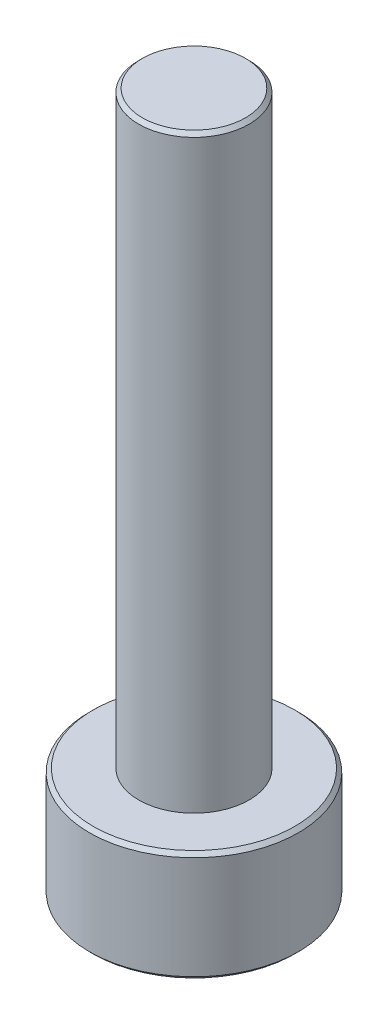
ISO-10303-21;
HEADER;
FILE_DESCRIPTION(('STEP AP214'),'2;1');
FILE_NAME('part.step','',(''),(''),'','','');
FILE_SCHEMA(('AUTOMOTIVE_DESIGN { 1 0 10303 214 1 1 1 1 }'));
ENDSEC;
DATA;
#1=APPLICATION_CONTEXT('core data for automotive mechanical design processes');
#2=APPLICATION_PROTOCOL_DEFINITION('international standard','automotive_design',2000,#1);
#3=PRODUCT_CONTEXT('',#1,'mechanical');
#4=PRODUCT('Part','Part','',(#3));
#5=PRODUCT_RELATED_PRODUCT_CATEGORY('part','',(#4));
#6=PRODUCT_DEFINITION_FORMATION('','',#4);
#7=PRODUCT_DEFINITION_CONTEXT('part definition',#1,'design');
#8=PRODUCT_DEFINITION('design','',#6,#7);
#9=PRODUCT_DEFINITION_SHAPE('','',#8);
#10=(LENGTH_UNIT() NAMED_UNIT(*) SI_UNIT(.MILLI.,.METRE.));
#11=(NAMED_UNIT(*) PLANE_ANGLE_UNIT() SI_UNIT($,.RADIAN.));
#12=(NAMED_UNIT(*) SI_UNIT($,.STERADIAN.) SOLID_ANGLE_UNIT());
#13=UNCERTAINTY_MEASURE_WITH_UNIT(LENGTH_MEASURE(1.E-05),#10,'distance_accuracy_value','');
#14=(GEOMETRIC_REPRESENTATION_CONTEXT(3) GLOBAL_UNCERTAINTY_ASSIGNED_CONTEXT((#13)) GLOBAL_UNIT_ASSIGNED_CONTEXT((#10,
#11,#12)) REPRESENTATION_CONTEXT('',''));
#15=CARTESIAN_POINT('',(0.,0.,0.));
#16=DIRECTION('',(0.,0.,1.));
#17=DIRECTION('',(1.,0.,0.));
#18=AXIS2_PLACEMENT_3D('',#15,#16,#17);
#19=CARTESIAN_POINT('',(0.,3.,0.));
#20=DIRECTION('',(0.,-1.,0.));
#21=DIRECTION('',(0.,0.,-1.));
#22=AXIS2_PLACEMENT_3D('',#19,#20,#21);
#23=CYLINDRICAL_SURFACE('',#22,2.84);
#24=CARTESIAN_POINT('',(0.,2.9,0.));
#25=DIRECTION('',(0.,1.,0.));
#26=DIRECTION('',(0.,0.,1.));
#27=AXIS2_PLACEMENT_3D('',#24,#25,#26);
#28=CIRCLE('',#27,2.84);
#29=CARTESIAN_POINT('',(0.,2.9,2.84));
#30=VERTEX_POINT('',#29);
#31=EDGE_CURVE('E44',#30,#30,#28,.F.);
#32=ORIENTED_EDGE('',*,*,#31,.T.);
#33=EDGE_LOOP('',(#32));
#34=FACE_BOUND('',#33,.T.);
#35=CARTESIAN_POINT('',(0.,0.100000000000001,0.));
#36=DIRECTION('',(0.,1.,0.));
#37=DIRECTION('',(0.,0.,1.));
#38=AXIS2_PLACEMENT_3D('',#35,#36,#37);
#39=CIRCLE('',#38,2.84);
#40=CARTESIAN_POINT('',(0.,0.100000000000001,2.84));
#41=VERTEX_POINT('',#40);
#42=EDGE_CURVE('E155',#41,#41,#39,.T.);
#43=ORIENTED_EDGE('',*,*,#42,.T.);
#44=EDGE_LOOP('',(#43));
#45=FACE_BOUND('',#44,.T.);
#46=ADVANCED_FACE('F36',(#34,#45),#23,.T.);
#47=CARTESIAN_POINT('',(0.,3.,0.));
#48=DIRECTION('',(0.,1.,0.));
#49=DIRECTION('',(0.,0.,1.));
#50=AXIS2_PLACEMENT_3D('',#47,#48,#49);
#51=PLANE('',#50);
#52=CARTESIAN_POINT('',(0.,3.,0.));
#53=DIRECTION('',(0.,1.,0.));
#54=DIRECTION('',(0.,0.,1.));
#55=AXIS2_PLACEMENT_3D('',#52,#53,#54);
#56=CIRCLE('',#55,2.74);
#57=CARTESIAN_POINT('',(0.,3.,2.74));
#58=VERTEX_POINT('',#57);
#59=EDGE_CURVE('E152',#58,#58,#56,.T.);
#60=ORIENTED_EDGE('',*,*,#59,.T.);
#61=EDGE_LOOP('',(#60));
#62=FACE_BOUND('',#61,.T.);
#63=CARTESIAN_POINT('',(0.,3.,0.));
#64=DIRECTION('',(0.,1.,0.));
#65=DIRECTION('',(0.,0.,1.));
#66=AXIS2_PLACEMENT_3D('',#63,#64,#65);
#67=CIRCLE('',#66,1.5);
#68=CARTESIAN_POINT('',(0.,3.,1.5));
#69=VERTEX_POINT('',#68);
#70=EDGE_CURVE('E138',#69,#69,#67,.T.);
#71=ORIENTED_EDGE('',*,*,#70,.F.);
#72=EDGE_LOOP('',(#71));
#73=FACE_BOUND('',#72,.T.);
#74=ADVANCED_FACE('F168',(#62,#73),#51,.T.);
#75=CARTESIAN_POINT('',(0.,0.,0.));
#76=DIRECTION('',(0.,1.,0.));
#77=DIRECTION('',(0.,0.,1.));
#78=AXIS2_PLACEMENT_3D('',#75,#76,#77);
#79=PLANE('',#78);
#80=CARTESIAN_POINT('',(0.,0.,0.));
#81=DIRECTION('',(0.,1.,0.));
#82=DIRECTION('',(0.,0.,1.));
#83=AXIS2_PLACEMENT_3D('',#80,#81,#82);
#84=CIRCLE('',#83,2.74);
#85=CARTESIAN_POINT('',(0.,0.,2.74));
#86=VERTEX_POINT('',#85);
#87=EDGE_CURVE('E11',#86,#86,#84,.F.);
#88=ORIENTED_EDGE('',*,*,#87,.T.);
#89=EDGE_LOOP('',(#88));
#90=FACE_BOUND('',#89,.T.);
#91=DIRECTION('',(0.,0.,1.));
#92=VECTOR('',#91,1.);
#93=CARTESIAN_POINT('',(1.29,0.,-0.744781847254618));
#94=LINE('',#93,#92);
#95=CARTESIAN_POINT('',(1.29,0.,-0.744781847254618));
#96=VERTEX_POINT('',#95);
#97=CARTESIAN_POINT('',(1.29,0.,0.744781847254619));
#98=VERTEX_POINT('',#97);
#99=EDGE_CURVE('E125',#96,#98,#94,.T.);
#100=ORIENTED_EDGE('',*,*,#99,.F.);
#101=DIRECTION('',(0.866025403784439,0.,0.5));
#102=VECTOR('',#101,1.);
#103=CARTESIAN_POINT('',(0.,0.,-1.48956369450924));
#104=LINE('',#103,#102);
#105=CARTESIAN_POINT('',(0.,0.,-1.48956369450924));
#106=VERTEX_POINT('',#105);
#107=EDGE_CURVE('E51',#106,#96,#104,.T.);
#108=ORIENTED_EDGE('',*,*,#107,.F.);
#109=DIRECTION('',(0.866025403784439,0.,-0.5));
#110=VECTOR('',#109,1.);
#111=CARTESIAN_POINT('',(-1.29,0.,-0.744781847254618));
#112=LINE('',#111,#110);
#113=CARTESIAN_POINT('',(-1.29,0.,-0.744781847254618));
#114=VERTEX_POINT('',#113);
#115=EDGE_CURVE('E134',#114,#106,#112,.T.);
#116=ORIENTED_EDGE('',*,*,#115,.F.);
#117=DIRECTION('',(0.,0.,-1.));
#118=VECTOR('',#117,1.);
#119=CARTESIAN_POINT('',(-1.29,0.,0.744781847254619));
#120=LINE('',#119,#118);
#121=CARTESIAN_POINT('',(-1.29,0.,0.744781847254619));
#122=VERTEX_POINT('',#121);
#123=EDGE_CURVE('E132',#122,#114,#120,.T.);
#124=ORIENTED_EDGE('',*,*,#123,.F.);
#125=DIRECTION('',(-0.866025403784439,0.,-0.5));
#126=VECTOR('',#125,1.);
#127=CARTESIAN_POINT('',(0.,0.,1.48956369450924));
#128=LINE('',#127,#126);
#129=CARTESIAN_POINT('',(0.,0.,1.48956369450924));
#130=VERTEX_POINT('',#129);
#131=EDGE_CURVE('E99',#130,#122,#128,.T.);
#132=ORIENTED_EDGE('',*,*,#131,.F.);
#133=DIRECTION('',(-0.866025403784439,0.,0.5));
#134=VECTOR('',#133,1.);
#135=CARTESIAN_POINT('',(1.29,0.,0.744781847254619));
#136=LINE('',#135,#134);
#137=EDGE_CURVE('E128',#98,#130,#136,.T.);
#138=ORIENTED_EDGE('',*,*,#137,.F.);
#139=EDGE_LOOP('',(#100,#108,#116,#124,#132,#138));
#140=FACE_BOUND('',#139,.T.);
#141=ADVANCED_FACE('F171',(#90,#140),#79,.F.);
#142=CARTESIAN_POINT('',(0.,19.,0.));
#143=DIRECTION('',(0.,-1.,0.));
#144=DIRECTION('',(0.,0.,-1.));
#145=AXIS2_PLACEMENT_3D('',#142,#143,#144);
#146=CYLINDRICAL_SURFACE('',#145,1.5);
#147=CARTESIAN_POINT('',(0.,18.9,0.));
#148=DIRECTION('',(0.,1.,0.));
#149=DIRECTION('',(0.,0.,1.));
#150=AXIS2_PLACEMENT_3D('',#147,#148,#149);
#151=CIRCLE('',#150,1.5);
#152=CARTESIAN_POINT('',(0.,18.9,1.5));
#153=VERTEX_POINT('',#152);
#154=EDGE_CURVE('E149',#153,#153,#151,.F.);
#155=ORIENTED_EDGE('',*,*,#154,.T.);
#156=EDGE_LOOP('',(#155));
#157=FACE_BOUND('',#156,.T.);
#158=ORIENTED_EDGE('',*,*,#70,.T.);
#159=EDGE_LOOP('',(#158));
#160=FACE_BOUND('',#159,.T.);
#161=ADVANCED_FACE('F175',(#157,#160),#146,.T.);
#162=CARTESIAN_POINT('',(0.,19.,0.));
#163=DIRECTION('',(0.,1.,0.));
#164=DIRECTION('',(0.,0.,1.));
#165=AXIS2_PLACEMENT_3D('',#162,#163,#164);
#166=PLANE('',#165);
#167=CARTESIAN_POINT('',(0.,19.,0.));
#168=DIRECTION('',(0.,1.,0.));
#169=DIRECTION('',(0.,0.,1.));
#170=AXIS2_PLACEMENT_3D('',#167,#168,#169);
#171=CIRCLE('',#170,1.4);
#172=CARTESIAN_POINT('',(0.,19.,1.4));
#173=VERTEX_POINT('',#172);
#174=EDGE_CURVE('E146',#173,#173,#171,.T.);
#175=ORIENTED_EDGE('',*,*,#174,.T.);
#176=EDGE_LOOP('',(#175));
#177=FACE_BOUND('',#176,.T.);
#178=ADVANCED_FACE('F177',(#177),#166,.T.);
#179=CARTESIAN_POINT('',(0.,1.3,-1.48956369450924));
#180=DIRECTION('',(0.5,0.,-0.866025403784439));
#181=DIRECTION('',(-0.866025403784439,0.,-0.5));
#182=AXIS2_PLACEMENT_3D('',#179,#180,#181);
#183=PLANE('',#182);
#184=ORIENTED_EDGE('',*,*,#107,.T.);
#185=DIRECTION('',(0.,-1.,0.));
#186=VECTOR('',#185,1.);
#187=CARTESIAN_POINT('',(1.29,1.3,-0.744781847254618));
#188=LINE('',#187,#186);
#189=CARTESIAN_POINT('',(1.29,1.3,-0.744781847254618));
#190=VERTEX_POINT('',#189);
#191=EDGE_CURVE('E81',#190,#96,#188,.T.);
#192=ORIENTED_EDGE('',*,*,#191,.F.);
#193=DIRECTION('',(0.866025403784439,0.,0.5));
#194=VECTOR('',#193,1.);
#195=CARTESIAN_POINT('',(0.,1.3,-1.48956369450924));
#196=LINE('',#195,#194);
#197=CARTESIAN_POINT('',(0.,1.3,-1.48956369450924));
#198=VERTEX_POINT('',#197);
#199=EDGE_CURVE('E136',#198,#190,#196,.T.);
#200=ORIENTED_EDGE('',*,*,#199,.F.);
#201=DIRECTION('',(0.,-1.,0.));
#202=VECTOR('',#201,1.);
#203=CARTESIAN_POINT('',(0.,1.3,-1.48956369450924));
#204=LINE('',#203,#202);
#205=EDGE_CURVE('E59',#198,#106,#204,.T.);
#206=ORIENTED_EDGE('',*,*,#205,.T.);
#207=EDGE_LOOP('',(#184,#192,#200,#206));
#208=FACE_BOUND('',#207,.T.);
#209=ADVANCED_FACE('F184',(#208),#183,.F.);
#210=CARTESIAN_POINT('',(-1.29,1.3,-0.744781847254618));
#211=DIRECTION('',(-0.5,0.,-0.866025403784439));
#212=DIRECTION('',(-0.866025403784439,0.,0.5));
#213=AXIS2_PLACEMENT_3D('',#210,#211,#212);
#214=PLANE('',#213);
#215=ORIENTED_EDGE('',*,*,#115,.T.);
#216=ORIENTED_EDGE('',*,*,#205,.F.);
#217=DIRECTION('',(0.866025403784439,0.,-0.5));
#218=VECTOR('',#217,1.);
#219=CARTESIAN_POINT('',(-1.29,1.3,-0.744781847254618));
#220=LINE('',#219,#218);
#221=CARTESIAN_POINT('',(-1.29,1.3,-0.744781847254618));
#222=VERTEX_POINT('',#221);
#223=EDGE_CURVE('E111',#222,#198,#220,.T.);
#224=ORIENTED_EDGE('',*,*,#223,.F.);
#225=DIRECTION('',(0.,-1.,0.));
#226=VECTOR('',#225,1.);
#227=CARTESIAN_POINT('',(-1.29,1.3,-0.744781847254618));
#228=LINE('',#227,#226);
#229=EDGE_CURVE('E103',#222,#114,#228,.T.);
#230=ORIENTED_EDGE('',*,*,#229,.T.);
#231=EDGE_LOOP('',(#215,#216,#224,#230));
#232=FACE_BOUND('',#231,.T.);
#233=ADVANCED_FACE('F211',(#232),#214,.F.);
#234=CARTESIAN_POINT('',(-1.29,1.3,0.744781847254619));
#235=DIRECTION('',(-1.,0.,0.));
#236=DIRECTION('',(0.,0.,1.));
#237=AXIS2_PLACEMENT_3D('',#234,#235,#236);
#238=PLANE('',#237);
#239=ORIENTED_EDGE('',*,*,#123,.T.);
#240=ORIENTED_EDGE('',*,*,#229,.F.);
#241=DIRECTION('',(0.,0.,-1.));
#242=VECTOR('',#241,1.);
#243=CARTESIAN_POINT('',(-1.29,1.3,0.744781847254619));
#244=LINE('',#243,#242);
#245=CARTESIAN_POINT('',(-1.29,1.3,0.744781847254619));
#246=VERTEX_POINT('',#245);
#247=EDGE_CURVE('E107',#246,#222,#244,.T.);
#248=ORIENTED_EDGE('',*,*,#247,.F.);
#249=DIRECTION('',(0.,-1.,0.));
#250=VECTOR('',#249,1.);
#251=CARTESIAN_POINT('',(-1.29,1.3,0.744781847254619));
#252=LINE('',#251,#250);
#253=EDGE_CURVE('E92',#246,#122,#252,.T.);
#254=ORIENTED_EDGE('',*,*,#253,.T.);
#255=EDGE_LOOP('',(#239,#240,#248,#254));
#256=FACE_BOUND('',#255,.T.);
#257=ADVANCED_FACE('F108',(#256),#238,.F.);
#258=CARTESIAN_POINT('',(0.,1.3,1.48956369450924));
#259=DIRECTION('',(-0.5,0.,0.866025403784439));
#260=DIRECTION('',(0.866025403784439,0.,0.5));
#261=AXIS2_PLACEMENT_3D('',#258,#259,#260);
#262=PLANE('',#261);
#263=ORIENTED_EDGE('',*,*,#131,.T.);
#264=ORIENTED_EDGE('',*,*,#253,.F.);
#265=DIRECTION('',(-0.866025403784439,0.,-0.5));
#266=VECTOR('',#265,1.);
#267=CARTESIAN_POINT('',(0.,1.3,1.48956369450924));
#268=LINE('',#267,#266);
#269=CARTESIAN_POINT('',(0.,1.3,1.48956369450924));
#270=VERTEX_POINT('',#269);
#271=EDGE_CURVE('E96',#270,#246,#268,.T.);
#272=ORIENTED_EDGE('',*,*,#271,.F.);
#273=DIRECTION('',(0.,-1.,0.));
#274=VECTOR('',#273,1.);
#275=CARTESIAN_POINT('',(0.,1.3,1.48956369450924));
#276=LINE('',#275,#274);
#277=EDGE_CURVE('E104',#270,#130,#276,.T.);
#278=ORIENTED_EDGE('',*,*,#277,.T.);
#279=EDGE_LOOP('',(#263,#264,#272,#278));
#280=FACE_BOUND('',#279,.T.);
#281=ADVANCED_FACE('F94',(#280),#262,.F.);
#282=CARTESIAN_POINT('',(1.29,1.3,0.744781847254619));
#283=DIRECTION('',(0.5,0.,0.866025403784439));
#284=DIRECTION('',(0.866025403784439,0.,-0.5));
#285=AXIS2_PLACEMENT_3D('',#282,#283,#284);
#286=PLANE('',#285);
#287=ORIENTED_EDGE('',*,*,#137,.T.);
#288=ORIENTED_EDGE('',*,*,#277,.F.);
#289=DIRECTION('',(-0.866025403784439,0.,0.5));
#290=VECTOR('',#289,1.);
#291=CARTESIAN_POINT('',(1.29,1.3,0.744781847254619));
#292=LINE('',#291,#290);
#293=CARTESIAN_POINT('',(1.29,1.3,0.744781847254619));
#294=VERTEX_POINT('',#293);
#295=EDGE_CURVE('E117',#294,#270,#292,.T.);
#296=ORIENTED_EDGE('',*,*,#295,.F.);
#297=DIRECTION('',(0.,-1.,0.));
#298=VECTOR('',#297,1.);
#299=CARTESIAN_POINT('',(1.29,1.3,0.744781847254619));
#300=LINE('',#299,#298);
#301=EDGE_CURVE('E141',#294,#98,#300,.T.);
#302=ORIENTED_EDGE('',*,*,#301,.T.);
#303=EDGE_LOOP('',(#287,#288,#296,#302));
#304=FACE_BOUND('',#303,.T.);
#305=ADVANCED_FACE('F207',(#304),#286,.F.);
#306=CARTESIAN_POINT('',(1.29,1.3,-0.744781847254618));
#307=DIRECTION('',(1.,0.,0.));
#308=DIRECTION('',(0.,0.,-1.));
#309=AXIS2_PLACEMENT_3D('',#306,#307,#308);
#310=PLANE('',#309);
#311=ORIENTED_EDGE('',*,*,#99,.T.);
#312=ORIENTED_EDGE('',*,*,#301,.F.);
#313=DIRECTION('',(0.,0.,1.));
#314=VECTOR('',#313,1.);
#315=CARTESIAN_POINT('',(1.29,1.3,-0.744781847254618));
#316=LINE('',#315,#314);
#317=EDGE_CURVE('E119',#190,#294,#316,.T.);
#318=ORIENTED_EDGE('',*,*,#317,.F.);
#319=ORIENTED_EDGE('',*,*,#191,.T.);
#320=EDGE_LOOP('',(#311,#312,#318,#319));
#321=FACE_BOUND('',#320,.T.);
#322=ADVANCED_FACE('F199',(#321),#310,.F.);
#323=CARTESIAN_POINT('',(0.,1.3,0.));
#324=DIRECTION('',(0.,-1.,0.));
#325=DIRECTION('',(0.,0.,-1.));
#326=AXIS2_PLACEMENT_3D('',#323,#324,#325);
#327=PLANE('',#326);
#328=ORIENTED_EDGE('',*,*,#199,.T.);
#329=ORIENTED_EDGE('',*,*,#317,.T.);
#330=ORIENTED_EDGE('',*,*,#295,.T.);
#331=ORIENTED_EDGE('',*,*,#271,.T.);
#332=ORIENTED_EDGE('',*,*,#247,.T.);
#333=ORIENTED_EDGE('',*,*,#223,.T.);
#334=EDGE_LOOP('',(#328,#329,#330,#331,#332,#333));
#335=FACE_BOUND('',#334,.T.);
#336=ADVANCED_FACE('F114',(#335),#327,.T.);
#337=CARTESIAN_POINT('',(0.,19.,0.));
#338=DIRECTION('',(0.,-1.,0.));
#339=DIRECTION('',(0.,0.,-1.));
#340=AXIS2_PLACEMENT_3D('',#337,#338,#339);
#341=CONICAL_SURFACE('',#340,1.4,0.785398163397453);
#342=ORIENTED_EDGE('',*,*,#154,.F.);
#343=EDGE_LOOP('',(#342));
#344=FACE_BOUND('',#343,.T.);
#345=ORIENTED_EDGE('',*,*,#174,.F.);
#346=EDGE_LOOP('',(#345));
#347=FACE_BOUND('',#346,.T.);
#348=ADVANCED_FACE('F165',(#344,#347),#341,.T.);
#349=CARTESIAN_POINT('',(0.,3.,0.));
#350=DIRECTION('',(0.,-1.,0.));
#351=DIRECTION('',(0.,0.,-1.));
#352=AXIS2_PLACEMENT_3D('',#349,#350,#351);
#353=CONICAL_SURFACE('',#352,2.74,0.785398163397448);
#354=ORIENTED_EDGE('',*,*,#31,.F.);
#355=EDGE_LOOP('',(#354));
#356=FACE_BOUND('',#355,.T.);
#357=ORIENTED_EDGE('',*,*,#59,.F.);
#358=EDGE_LOOP('',(#357));
#359=FACE_BOUND('',#358,.T.);
#360=ADVANCED_FACE('F162',(#356,#359),#353,.T.);
#361=CARTESIAN_POINT('',(0.,0.100000000000001,0.));
#362=DIRECTION('',(0.,1.,0.));
#363=DIRECTION('',(0.,0.,1.));
#364=AXIS2_PLACEMENT_3D('',#361,#362,#363);
#365=CONICAL_SURFACE('',#364,2.84,0.785398163397446);
#366=ORIENTED_EDGE('',*,*,#87,.F.);
#367=EDGE_LOOP('',(#366));
#368=FACE_BOUND('',#367,.T.);
#369=ORIENTED_EDGE('',*,*,#42,.F.);
#370=EDGE_LOOP('',(#369));
#371=FACE_BOUND('',#370,.T.);
#372=ADVANCED_FACE('F38',(#368,#371),#365,.T.);
#373=CLOSED_SHELL('',(#46,#74,#141,#161,#178,#209,#233,#257,#281,#305,#322,#336,#348,#360,#372));
#374=MANIFOLD_SOLID_BREP('B2',#373);
#375=ADVANCED_BREP_SHAPE_REPRESENTATION('',(#18,#374),#14);
#376=SHAPE_DEFINITION_REPRESENTATION(#9,#375);
ENDSEC;
END-ISO-10303-21;
